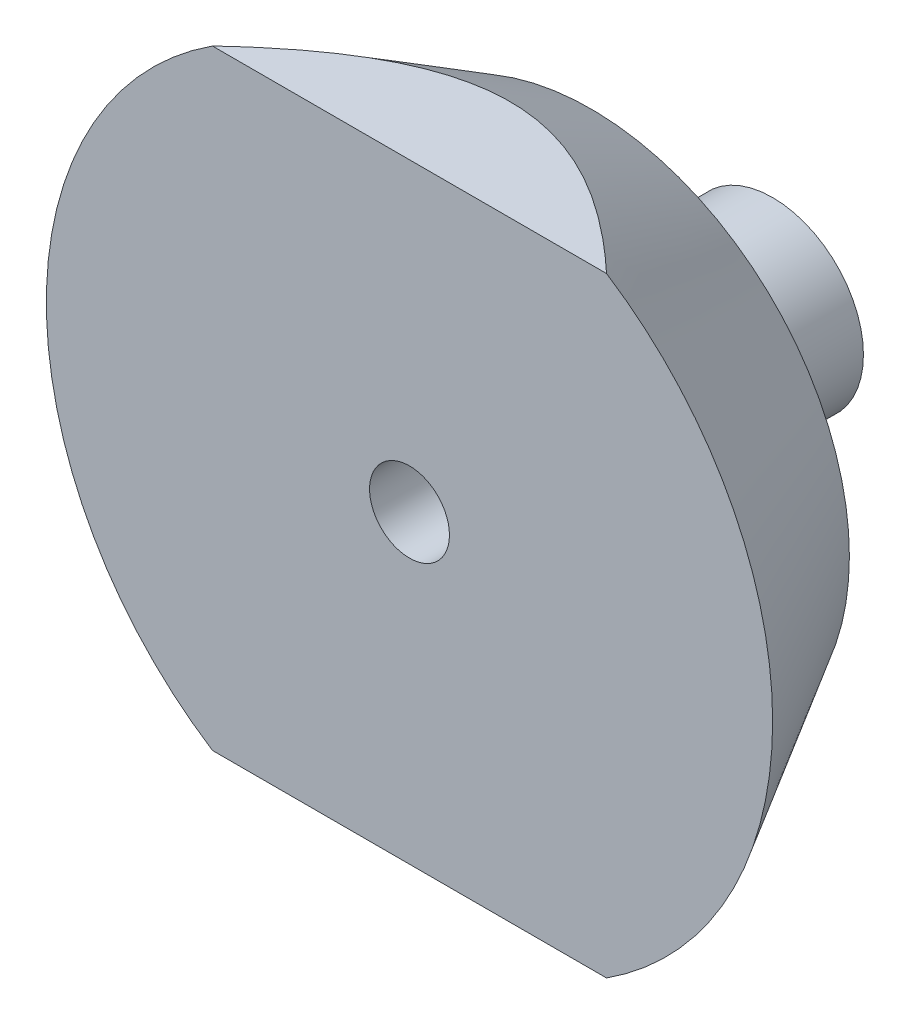
ISO-10303-21;
HEADER;
FILE_DESCRIPTION(('STEP AP214'),'2;1');
FILE_NAME('part.step','',(''),(''),'','','');
FILE_SCHEMA(('AUTOMOTIVE_DESIGN { 1 0 10303 214 1 1 1 1 }'));
ENDSEC;
DATA;
#1=APPLICATION_CONTEXT('core data for automotive mechanical design processes');
#2=APPLICATION_PROTOCOL_DEFINITION('international standard','automotive_design',2000,#1);
#3=PRODUCT_CONTEXT('',#1,'mechanical');
#4=PRODUCT('Part','Part','',(#3));
#5=PRODUCT_RELATED_PRODUCT_CATEGORY('part','',(#4));
#6=PRODUCT_DEFINITION_FORMATION('','',#4);
#7=PRODUCT_DEFINITION_CONTEXT('part definition',#1,'design');
#8=PRODUCT_DEFINITION('design','',#6,#7);
#9=PRODUCT_DEFINITION_SHAPE('','',#8);
#10=(LENGTH_UNIT() NAMED_UNIT(*) SI_UNIT(.MILLI.,.METRE.));
#11=(NAMED_UNIT(*) PLANE_ANGLE_UNIT() SI_UNIT($,.RADIAN.));
#12=(NAMED_UNIT(*) SI_UNIT($,.STERADIAN.) SOLID_ANGLE_UNIT());
#13=UNCERTAINTY_MEASURE_WITH_UNIT(LENGTH_MEASURE(1.E-05),#10,'distance_accuracy_value','');
#14=(GEOMETRIC_REPRESENTATION_CONTEXT(3) GLOBAL_UNCERTAINTY_ASSIGNED_CONTEXT((#13)) GLOBAL_UNIT_ASSIGNED_CONTEXT((#10,
#11,#12)) REPRESENTATION_CONTEXT('',''));
#15=CARTESIAN_POINT('',(0.,0.,0.));
#16=DIRECTION('',(0.,0.,1.));
#17=DIRECTION('',(1.,0.,0.));
#18=AXIS2_PLACEMENT_3D('',#15,#16,#17);
#19=CARTESIAN_POINT('',(0.,0.,-25.));
#20=DIRECTION('',(0.,0.,1.));
#21=DIRECTION('',(1.,0.,0.));
#22=AXIS2_PLACEMENT_3D('',#19,#20,#21);
#23=PLANE('',#22);
#24=CARTESIAN_POINT('',(0.,0.,-25.));
#25=DIRECTION('',(0.,0.,1.));
#26=DIRECTION('',(1.,0.,0.));
#27=AXIS2_PLACEMENT_3D('',#24,#25,#26);
#28=CIRCLE('',#27,35.5662432702593);
#29=CARTESIAN_POINT('',(35.5662432702593,0.,-25.));
#30=VERTEX_POINT('',#29);
#31=EDGE_CURVE('E74',#30,#30,#28,.T.);
#32=ORIENTED_EDGE('',*,*,#31,.F.);
#33=EDGE_LOOP('',(#32));
#34=FACE_BOUND('',#33,.T.);
#35=CARTESIAN_POINT('',(0.,0.,-25.));
#36=DIRECTION('',(0.,0.,1.));
#37=DIRECTION('',(1.,0.,0.));
#38=AXIS2_PLACEMENT_3D('',#35,#36,#37);
#39=CIRCLE('',#38,12.5);
#40=CARTESIAN_POINT('',(12.5,0.,-25.));
#41=VERTEX_POINT('',#40);
#42=EDGE_CURVE('E65',#41,#41,#39,.F.);
#43=ORIENTED_EDGE('',*,*,#42,.F.);
#44=EDGE_LOOP('',(#43));
#45=FACE_BOUND('',#44,.T.);
#46=ADVANCED_FACE('F34',(#34,#45),#23,.F.);
#47=CARTESIAN_POINT('',(0.,0.,0.));
#48=DIRECTION('',(0.,0.,1.));
#49=DIRECTION('',(1.,0.,0.));
#50=AXIS2_PLACEMENT_3D('',#47,#48,#49);
#51=CONICAL_SURFACE('',#50,50.,0.523598775598299);
#52=CARTESIAN_POINT('',(-62.6660818149811,42.,44.0615841168655));
#53=CARTESIAN_POINT('',(-61.9947410984222,42.,43.0956864215137));
#54=CARTESIAN_POINT('',(-61.3211627775136,42.,42.1313402496294));
#55=CARTESIAN_POINT('',(-59.9690885189031,42.,40.2060904834421));
#56=CARTESIAN_POINT('',(-59.2905925416595,42.,39.2451869169133));
#57=CARTESIAN_POINT('',(-57.9281233807932,42.,37.3269972796684));
#58=CARTESIAN_POINT('',(-57.244149192084,42.,36.3697119225105));
#59=CARTESIAN_POINT('',(-55.8703430759937,42.,34.4593546918073));
#60=CARTESIAN_POINT('',(-55.1805111590199,42.,33.5062828107808));
#61=CARTESIAN_POINT('',(-53.7887816516999,42.,31.5970926210159));
#62=CARTESIAN_POINT('',(-53.0868315615743,42.,30.6410125635106));
#63=CARTESIAN_POINT('',(-51.6757317812286,42.,28.7341810677412));
#64=CARTESIAN_POINT('',(-50.9665821085206,42.,27.7834296165247));
#65=CARTESIAN_POINT('',(-49.540384342603,42.,25.8879999039432));
#66=CARTESIAN_POINT('',(-48.8233369687861,42.,24.9433211016402));
#67=CARTESIAN_POINT('',(-47.3804118592806,42.,23.0607386979087));
#68=CARTESIAN_POINT('',(-46.6545341899994,42.,22.1228350456127));
#69=CARTESIAN_POINT('',(-45.1242995807392,42.,20.1669947824872));
#70=CARTESIAN_POINT('',(-44.3189747120633,42.,19.1498145297742));
#71=CARTESIAN_POINT('',(-42.695003014512,42.,17.1261228495684));
#72=CARTESIAN_POINT('',(-41.8763561112709,42.,16.1196114816827));
#73=CARTESIAN_POINT('',(-40.2236364563716,42.,14.1187307038334));
#74=CARTESIAN_POINT('',(-39.389558473168,42.,13.1243656087501));
#75=CARTESIAN_POINT('',(-37.7040933652294,42.,11.1504094711475));
#76=CARTESIAN_POINT('',(-36.8527064588542,42.,10.1708182425205));
#77=CARTESIAN_POINT('',(-35.13314997558,42.,8.2327922579927));
#78=CARTESIAN_POINT('',(-34.2650525966472,42.,7.27429357646646));
#79=CARTESIAN_POINT('',(-32.5059585816512,42.,5.3783771896856));
#80=CARTESIAN_POINT('',(-31.6149606162669,42.,4.44096071414883));
#81=CARTESIAN_POINT('',(-29.807013027872,42.,2.5926240222418));
#82=CARTESIAN_POINT('',(-28.890080711358,42.,1.68168692205313));
#83=CARTESIAN_POINT('',(-27.0254087752125,42.,-0.107976363779266));
#84=CARTESIAN_POINT('',(-26.0776746617395,42.,-0.986708247350626));
#85=CARTESIAN_POINT('',(-24.5954205679735,42.,-2.30416319990149));
#86=CARTESIAN_POINT('',(-24.0737823644993,42.,-2.75740394401919));
#87=CARTESIAN_POINT('',(-23.0192309413,42.,-3.65062735944111));
#88=CARTESIAN_POINT('',(-22.4863175416664,42.,-4.09060981892238));
#89=CARTESIAN_POINT('',(-21.4079713031547,42.,-4.95562780290153));
#90=CARTESIAN_POINT('',(-20.8625315015475,42.,-5.38065466496564));
#91=CARTESIAN_POINT('',(-19.7584279094841,42.,-6.2132042341337));
#92=CARTESIAN_POINT('',(-19.1997642798946,42.,-6.62072715400205));
#93=CARTESIAN_POINT('',(-18.0743232147787,42.,-7.41126322187428));
#94=CARTESIAN_POINT('',(-17.5076990084026,42.,-7.79449388207739));
#95=CARTESIAN_POINT('',(-16.3595601498972,42.,-8.53811086745244));
#96=CARTESIAN_POINT('',(-15.7780447041416,42.,-8.89849597150164));
#97=CARTESIAN_POINT('',(-14.5998337125875,42.,-9.59250497833902));
#98=CARTESIAN_POINT('',(-14.0031510066367,42.,-9.92615058486232));
#99=CARTESIAN_POINT('',(-12.7936835758078,42.,-10.5628176269368));
#100=CARTESIAN_POINT('',(-12.1809005733317,42.,-10.865842321626));
#101=CARTESIAN_POINT('',(-10.8695896535529,42.,-11.4685589403372));
#102=CARTESIAN_POINT('',(-10.1691335434055,42.,-11.764092392304));
#103=CARTESIAN_POINT('',(-8.74890634354462,42.,-12.3045518400042));
#104=CARTESIAN_POINT('',(-8.02913744933954,42.,-12.5494835609144));
#105=CARTESIAN_POINT('',(-6.57304864221835,42.,-12.98138985883));
#106=CARTESIAN_POINT('',(-5.83674629025654,42.,-13.1684230742669));
#107=CARTESIAN_POINT('',(-4.35063596778118,42.,-13.478313424225));
#108=CARTESIAN_POINT('',(-3.60082828590588,42.,-13.6011719286197));
#109=CARTESIAN_POINT('',(-2.08661958786141,42.,-13.7785301012982));
#110=CARTESIAN_POINT('',(-1.32214873216728,42.,-13.8324409879208));
#111=CARTESIAN_POINT('',(0.208445879240947,42.,-13.8675848666588));
#112=CARTESIAN_POINT('',(0.974569564418981,42.,-13.8488209012358));
#113=CARTESIAN_POINT('',(2.50187487611513,42.,-13.7394442144813));
#114=CARTESIAN_POINT('',(3.26305477006937,42.,-13.6488075445149));
#115=CARTESIAN_POINT('',(4.77415585579113,42.,-13.399541367933));
#116=CARTESIAN_POINT('',(5.52407530702997,42.,-13.2409014597738));
#117=CARTESIAN_POINT('',(7.17219148132458,42.,-12.8196696504264));
#118=CARTESIAN_POINT('',(8.06648765436703,42.,-12.5418445630745));
#119=CARTESIAN_POINT('',(9.82630494481529,42.,-11.9068713596006));
#120=CARTESIAN_POINT('',(10.6918166603138,42.,-11.5496976126681));
#121=CARTESIAN_POINT('',(12.3947671844926,42.,-10.7681038956561));
#122=CARTESIAN_POINT('',(13.2321163491136,42.,-10.3434900388574));
#123=CARTESIAN_POINT('',(14.4652747899752,42.,-9.66570296258866));
#124=CARTESIAN_POINT('',(14.872520241991,42.,-9.43296063537934));
#125=CARTESIAN_POINT('',(15.6797050812778,42.,-8.95508159989258));
#126=CARTESIAN_POINT('',(16.0796442454543,42.,-8.70994451400477));
#127=CARTESIAN_POINT('',(16.9932524277029,42.,-8.13206051707581));
#128=CARTESIAN_POINT('',(17.5044333618833,42.,-7.79538286613526));
#129=CARTESIAN_POINT('',(18.5154072491166,42.,-7.10528622472515));
#130=CARTESIAN_POINT('',(19.0151990175825,42.,-6.7518655044735));
#131=CARTESIAN_POINT('',(20.0042243687353,42.,-6.03019258176722));
#132=CARTESIAN_POINT('',(20.4934539404683,42.,-5.66193489205611));
#133=CARTESIAN_POINT('',(21.4618771555972,42.,-4.91243098542184));
#134=CARTESIAN_POINT('',(21.9410701925615,42.,-4.53118398728815));
#135=CARTESIAN_POINT('',(23.3662664334984,42.,-3.36893126182257));
#136=CARTESIAN_POINT('',(24.2982148914263,42.,-2.57064780328997));
#137=CARTESIAN_POINT('',(26.1294749841585,42.,-0.938069651921674));
#138=CARTESIAN_POINT('',(27.0287919843101,42.,-0.103780929005354));
#139=CARTESIAN_POINT('',(28.8112296234937,42.,1.60509319008829));
#140=CARTESIAN_POINT('',(29.6939775474352,42.,2.48006615046062));
#141=CARTESIAN_POINT('',(31.4347871674004,42.,4.25422517660469));
#142=CARTESIAN_POINT('',(32.2928479837559,42.,5.1534121029805));
#143=CARTESIAN_POINT('',(33.5633719711067,42.,6.51657486850111));
#144=CARTESIAN_POINT('',(33.9838805667921,42.,6.9730915996181));
#145=CARTESIAN_POINT('',(34.8199174331674,42.,7.89066572586818));
#146=CARTESIAN_POINT('',(35.2354457068212,42.,8.35172311829865));
#147=CARTESIAN_POINT('',(36.0618361148956,42.,9.27796021535728));
#148=CARTESIAN_POINT('',(36.4726984593376,42.,9.74313973275011));
#149=CARTESIAN_POINT('',(37.290077415774,42.,10.6772977520941));
#150=CARTESIAN_POINT('',(37.6965940279883,42.,11.1462762538531));
#151=CARTESIAN_POINT('',(39.0540571673332,42.,12.7260138550006));
#152=CARTESIAN_POINT('',(39.9957830185699,42.,13.8447100527444));
#153=CARTESIAN_POINT('',(41.859920790794,42.,16.0981078710453));
#154=CARTESIAN_POINT('',(42.7823319066966,42.,17.2328101554883));
#155=CARTESIAN_POINT('',(44.6105470916075,42.,19.5157846897765));
#156=CARTESIAN_POINT('',(45.5163486055523,42.,20.6640589834644));
#157=CARTESIAN_POINT('',(47.3133430070883,42.,22.9719424712024));
#158=CARTESIAN_POINT('',(48.2045360847345,42.,24.131551517474));
#159=CARTESIAN_POINT('',(49.9746534388642,42.,26.4611777381564));
#160=CARTESIAN_POINT('',(50.8535700799965,42.,27.6312007083542));
#161=CARTESIAN_POINT('',(52.6001093240762,42.,29.9796437797838));
#162=CARTESIAN_POINT('',(53.4677318949706,42.,31.1580639048324));
#163=CARTESIAN_POINT('',(55.1928982134197,42.,33.5221167703124));
#164=CARTESIAN_POINT('',(56.0504427187179,42.,34.7077489581827));
#165=CARTESIAN_POINT('',(57.7566113612835,42.,37.0854083910496));
#166=CARTESIAN_POINT('',(58.6052355081823,42.,38.2774356291393));
#167=CARTESIAN_POINT('',(60.2969062409541,42.,40.6705282740218));
#168=CARTESIAN_POINT('',(61.1399300894684,42.,41.8716097461957));
#169=CARTESIAN_POINT('',(62.8187639028568,42.,44.2788057734581));
#170=CARTESIAN_POINT('',(63.6545738455904,42.,45.4849203439771));
#171=CARTESIAN_POINT('',(66.1522863435999,42.,49.1099965644729));
#172=CARTESIAN_POINT('',(67.8044557048528,42.,51.5356682205054));
#173=CARTESIAN_POINT('',(71.0869067819389,42.,56.400553071834));
#174=CARTESIAN_POINT('',(72.7171957179092,42.,58.8397614050304));
#175=CARTESIAN_POINT('',(75.9599955123153,42.,63.7299396845167));
#176=CARTESIAN_POINT('',(77.5725064694076,42.,66.180909565429));
#177=CARTESIAN_POINT('',(80.592446879611,42.,70.8017483185813));
#178=CARTESIAN_POINT('',(82.0015452629966,42.,72.9705275495839));
#179=CARTESIAN_POINT('',(84.809646946218,42.,77.3146103072859));
#180=CARTESIAN_POINT('',(86.2086502429901,42.,79.4899138359652));
#181=CARTESIAN_POINT('',(88.9979806990021,42.,83.8463707371419));
#182=CARTESIAN_POINT('',(90.3883070054502,42.,86.0275246554197));
#183=CARTESIAN_POINT('',(93.1612193779019,42.,90.3947475031302));
#184=CARTESIAN_POINT('',(94.5438054387823,42.,92.5808164358147));
#185=CARTESIAN_POINT('',(97.2948953401354,42.,96.9457685373383));
#186=CARTESIAN_POINT('',(98.6634350035376,42.,99.1246291347908));
#187=CARTESIAN_POINT('',(101.394502171229,42.,103.486115586527));
#188=CARTESIAN_POINT('',(102.757029672721,42.,105.668741442563));
#189=CARTESIAN_POINT('',(105.476552882464,42.,110.037060537815));
#190=CARTESIAN_POINT('',(106.833549255268,42.,112.222753363422));
#191=CARTESIAN_POINT('',(109.54271655707,42.,116.597121847152));
#192=CARTESIAN_POINT('',(110.894887495592,42.,118.785797499375));
#193=CARTESIAN_POINT('',(112.244916652511,42.,120.975791686796));
#194=B_SPLINE_CURVE_WITH_KNOTS('',3,(#52,#53,#54,#55,#56,#57,#58,#59,#60,#61,#62,#63,#64,#65,
#66,#67,#68,#69,#70,#71,#72,#73,#74,#75,#76,#77,#78,#79,#80,#81,#82,#83,#84,#85,#86,#87,#88,#89,
#90,#91,#92,#93,#94,#95,#96,#97,#98,#99,#100,#101,#102,#103,#104,#105,#106,#107,#108,#109,#110,
#111,#112,#113,#114,#115,#116,#117,#118,#119,#120,#121,#122,#123,#124,#125,#126,#127,#128,#129,
#130,#131,#132,#133,#134,#135,#136,#137,#138,#139,#140,#141,#142,#143,#144,#145,#146,#147,#148,
#149,#150,#151,#152,#153,#154,#155,#156,#157,#158,#159,#160,#161,#162,#163,#164,#165,#166,#167,
#168,#169,#170,#171,#172,#173,#174,#175,#176,#177,#178,#179,#180,#181,#182,#183,#184,#185,#186,
#187,#188,#189,#190,#191,#192,#193),.UNSPECIFIED.,.F.,.F.,(4,2,2,2,2,2,2,2,2,2,2,2,2,2,2,2,2,2,
2,2,2,2,2,2,2,2,2,2,2,2,2,2,2,2,2,2,2,2,2,2,2,2,2,2,2,2,2,2,2,2,2,2,2,2,2,2,2,2,2,2,2,2,2,2,2,2,
2,2,2,2,4),(0.,3.52886951027551,7.05776742692678,10.5873283388627,14.1168829813054,
17.6751395904477,21.2333875466062,24.791314023206,28.349213759227,32.2412654055268,
36.1333387853649,40.0267567814946,43.9201256908513,47.7993517991019,51.6788035974736,
55.555724956098,59.431957043779,61.504892617826,63.5778612928928,65.6520115239428,
67.7261365360847,69.7778160582638,71.8296051529006,73.8797116336323,75.9295996808594,
78.2086158954375,80.4873741163706,82.763816849057,85.0402109868086,87.3359174757515,
89.631527858229,91.9279034804246,94.2246304738243,97.0294728722618,99.8352225977254,
102.649189793107,104.056198435846,105.46324996942,107.299142458357,109.13522503485,
110.971993010179,112.808871649158,116.488855674081,120.16823185923,123.896380638659,
127.624662097951,129.486652357838,131.348641509528,133.21054651502,135.072451426321,
139.459069071781,143.845869199531,148.233338583701,152.620750841742,157.010780162874,
161.400821940342,165.790531502651,170.180236324903,174.58243003139,178.984637244046,
187.789134262293,196.590650755519,205.39211838126,213.1511120612,220.910108095832,
228.669855056145,236.429607151909,244.148599336095,251.867595112348,259.585634386965,
267.303658419854),.UNSPECIFIED.);
#195=CARTESIAN_POINT('',(27.1293199325011,42.,0.));
#196=VERTEX_POINT('',#195);
#197=CARTESIAN_POINT('',(-27.1293199325011,42.,0.));
#198=VERTEX_POINT('',#197);
#199=EDGE_CURVE('E55',#196,#198,#194,.F.);
#200=ORIENTED_EDGE('',*,*,#199,.F.);
#201=CARTESIAN_POINT('',(0.,0.,0.));
#202=DIRECTION('',(0.,0.,1.));
#203=DIRECTION('',(1.,0.,0.));
#204=AXIS2_PLACEMENT_3D('',#201,#202,#203);
#205=CIRCLE('',#204,50.);
#206=CARTESIAN_POINT('',(27.1293199325011,-42.,0.));
#207=VERTEX_POINT('',#206);
#208=EDGE_CURVE('E70',#207,#196,#205,.T.);
#209=ORIENTED_EDGE('',*,*,#208,.F.);
#210=CARTESIAN_POINT('',(-62.6660818149811,-42.,44.0615841168655));
#211=CARTESIAN_POINT('',(-61.9947410984222,-42.,43.0956864215136));
#212=CARTESIAN_POINT('',(-61.3211627775136,-42.,42.1313402496294));
#213=CARTESIAN_POINT('',(-59.9690885189031,-42.,40.2060904834421));
#214=CARTESIAN_POINT('',(-59.2905925416595,-42.,39.2451869169133));
#215=CARTESIAN_POINT('',(-57.9281233807932,-42.,37.3269972796684));
#216=CARTESIAN_POINT('',(-57.244149192084,-42.,36.3697119225105));
#217=CARTESIAN_POINT('',(-55.8703430759937,-42.,34.4593546918073));
#218=CARTESIAN_POINT('',(-55.1805111590199,-42.,33.5062828107807));
#219=CARTESIAN_POINT('',(-53.7887816516999,-42.,31.5970926210159));
#220=CARTESIAN_POINT('',(-53.0868315615743,-42.,30.6410125635106));
#221=CARTESIAN_POINT('',(-51.6757317812286,-42.,28.7341810677412));
#222=CARTESIAN_POINT('',(-50.9665821085206,-42.,27.7834296165247));
#223=CARTESIAN_POINT('',(-49.540384342603,-42.,25.8879999039432));
#224=CARTESIAN_POINT('',(-48.8233369687861,-42.,24.9433211016402));
#225=CARTESIAN_POINT('',(-47.3804118592806,-42.,23.0607386979087));
#226=CARTESIAN_POINT('',(-46.6545341899994,-42.,22.1228350456127));
#227=CARTESIAN_POINT('',(-45.1242995807392,-42.,20.1669947824872));
#228=CARTESIAN_POINT('',(-44.3189747120633,-42.,19.1498145297742));
#229=CARTESIAN_POINT('',(-42.695003014512,-42.,17.1261228495683));
#230=CARTESIAN_POINT('',(-41.8763561112709,-42.,16.1196114816827));
#231=CARTESIAN_POINT('',(-40.2236364563716,-42.,14.1187307038334));
#232=CARTESIAN_POINT('',(-39.389558473168,-42.,13.1243656087501));
#233=CARTESIAN_POINT('',(-37.7040933652294,-42.,11.1504094711475));
#234=CARTESIAN_POINT('',(-36.8527064588542,-42.,10.1708182425205));
#235=CARTESIAN_POINT('',(-35.13314997558,-42.,8.23279225799269));
#236=CARTESIAN_POINT('',(-34.2650525966472,-42.,7.27429357646645));
#237=CARTESIAN_POINT('',(-32.5059585816512,-42.,5.37837718968559));
#238=CARTESIAN_POINT('',(-31.6149606162669,-42.,4.44096071414882));
#239=CARTESIAN_POINT('',(-29.807013027872,-42.,2.59262402224179));
#240=CARTESIAN_POINT('',(-28.890080711358,-42.,1.68168692205312));
#241=CARTESIAN_POINT('',(-27.0254087752125,-42.,-0.107976363779276));
#242=CARTESIAN_POINT('',(-26.0776746617395,-42.,-0.986708247350637));
#243=CARTESIAN_POINT('',(-24.5954205679735,-42.,-2.30416319990149));
#244=CARTESIAN_POINT('',(-24.0737823644993,-42.,-2.75740394401919));
#245=CARTESIAN_POINT('',(-23.0192309413,-42.,-3.6506273594411));
#246=CARTESIAN_POINT('',(-22.4863175416664,-42.,-4.09060981892239));
#247=CARTESIAN_POINT('',(-21.4079713031546,-42.,-4.95562780290153));
#248=CARTESIAN_POINT('',(-20.8625315015475,-42.,-5.38065466496564));
#249=CARTESIAN_POINT('',(-19.7584279094841,-42.,-6.2132042341337));
#250=CARTESIAN_POINT('',(-19.1997642798946,-42.,-6.62072715400205));
#251=CARTESIAN_POINT('',(-18.0743232147787,-42.,-7.41126322187428));
#252=CARTESIAN_POINT('',(-17.5076990084025,-42.,-7.79449388207739));
#253=CARTESIAN_POINT('',(-16.3595601498972,-42.,-8.53811086745244));
#254=CARTESIAN_POINT('',(-15.7780447041416,-42.,-8.89849597150162));
#255=CARTESIAN_POINT('',(-14.5998337125875,-42.,-9.59250497833901));
#256=CARTESIAN_POINT('',(-14.0031510066367,-42.,-9.92615058486232));
#257=CARTESIAN_POINT('',(-12.7936835758078,-42.,-10.5628176269368));
#258=CARTESIAN_POINT('',(-12.1809005733317,-42.,-10.865842321626));
#259=CARTESIAN_POINT('',(-10.8695896535529,-42.,-11.4685589403372));
#260=CARTESIAN_POINT('',(-10.1691335434055,-42.,-11.764092392304));
#261=CARTESIAN_POINT('',(-8.74890634354461,-42.,-12.3045518400042));
#262=CARTESIAN_POINT('',(-8.02913744933952,-42.,-12.5494835609144));
#263=CARTESIAN_POINT('',(-6.57304864221834,-42.,-12.98138985883));
#264=CARTESIAN_POINT('',(-5.83674629025653,-42.,-13.1684230742669));
#265=CARTESIAN_POINT('',(-4.35063596778118,-42.,-13.478313424225));
#266=CARTESIAN_POINT('',(-3.60082828590588,-42.,-13.6011719286197));
#267=CARTESIAN_POINT('',(-2.08661958786141,-42.,-13.7785301012982));
#268=CARTESIAN_POINT('',(-1.32214873216728,-42.,-13.8324409879208));
#269=CARTESIAN_POINT('',(0.208445879240947,-42.,-13.8675848666588));
#270=CARTESIAN_POINT('',(0.97456956441898,-42.,-13.8488209012358));
#271=CARTESIAN_POINT('',(2.50187487611512,-42.,-13.7394442144813));
#272=CARTESIAN_POINT('',(3.26305477006937,-42.,-13.6488075445148));
#273=CARTESIAN_POINT('',(4.77415585579113,-42.,-13.399541367933));
#274=CARTESIAN_POINT('',(5.52407530702997,-42.,-13.2409014597738));
#275=CARTESIAN_POINT('',(7.17219148132458,-42.,-12.8196696504264));
#276=CARTESIAN_POINT('',(8.06648765436702,-42.,-12.5418445630745));
#277=CARTESIAN_POINT('',(9.82630494481528,-42.,-11.9068713596006));
#278=CARTESIAN_POINT('',(10.6918166603138,-42.,-11.549697612668));
#279=CARTESIAN_POINT('',(12.3947671844925,-42.,-10.7681038956561));
#280=CARTESIAN_POINT('',(13.2321163491135,-42.,-10.3434900388574));
#281=CARTESIAN_POINT('',(14.4652747899751,-42.,-9.66570296258865));
#282=CARTESIAN_POINT('',(14.872520241991,-42.,-9.43296063537933));
#283=CARTESIAN_POINT('',(15.6797050812778,-42.,-8.95508159989258));
#284=CARTESIAN_POINT('',(16.0796442454543,-42.,-8.70994451400477));
#285=CARTESIAN_POINT('',(16.9932524277029,-42.,-8.13206051707581));
#286=CARTESIAN_POINT('',(17.5044333618833,-42.,-7.79538286613525));
#287=CARTESIAN_POINT('',(18.5154072491166,-42.,-7.10528622472515));
#288=CARTESIAN_POINT('',(19.0151990175825,-42.,-6.7518655044735));
#289=CARTESIAN_POINT('',(20.0042243687353,-42.,-6.03019258176723));
#290=CARTESIAN_POINT('',(20.4934539404682,-42.,-5.66193489205611));
#291=CARTESIAN_POINT('',(21.4618771555972,-42.,-4.91243098542184));
#292=CARTESIAN_POINT('',(21.9410701925615,-42.,-4.53118398728815));
#293=CARTESIAN_POINT('',(23.3662664334984,-42.,-3.36893126182258));
#294=CARTESIAN_POINT('',(24.2982148914263,-42.,-2.57064780328997));
#295=CARTESIAN_POINT('',(26.1294749841585,-42.,-0.938069651921674));
#296=CARTESIAN_POINT('',(27.0287919843101,-42.,-0.10378092900536));
#297=CARTESIAN_POINT('',(28.8112296234937,-42.,1.60509319008828));
#298=CARTESIAN_POINT('',(29.6939775474352,-42.,2.48006615046062));
#299=CARTESIAN_POINT('',(31.4347871674004,-42.,4.2542251766047));
#300=CARTESIAN_POINT('',(32.2928479837559,-42.,5.15341210298049));
#301=CARTESIAN_POINT('',(33.5633719711066,-42.,6.5165748685011));
#302=CARTESIAN_POINT('',(33.9838805667921,-42.,6.9730915996181));
#303=CARTESIAN_POINT('',(34.8199174331674,-42.,7.89066572586818));
#304=CARTESIAN_POINT('',(35.2354457068212,-42.,8.35172311829865));
#305=CARTESIAN_POINT('',(36.0618361148956,-42.,9.27796021535728));
#306=CARTESIAN_POINT('',(36.4726984593375,-42.,9.74313973275009));
#307=CARTESIAN_POINT('',(37.290077415774,-42.,10.6772977520941));
#308=CARTESIAN_POINT('',(37.6965940279883,-42.,11.1462762538531));
#309=CARTESIAN_POINT('',(39.0540571673332,-42.,12.7260138550006));
#310=CARTESIAN_POINT('',(39.9957830185699,-42.,13.8447100527444));
#311=CARTESIAN_POINT('',(41.859920790794,-42.,16.0981078710453));
#312=CARTESIAN_POINT('',(42.7823319066965,-42.,17.2328101554883));
#313=CARTESIAN_POINT('',(44.6105470916075,-42.,19.5157846897764));
#314=CARTESIAN_POINT('',(45.5163486055523,-42.,20.6640589834644));
#315=CARTESIAN_POINT('',(47.3133430070883,-42.,22.9719424712024));
#316=CARTESIAN_POINT('',(48.2045360847345,-42.,24.131551517474));
#317=CARTESIAN_POINT('',(49.9746534388642,-42.,26.4611777381564));
#318=CARTESIAN_POINT('',(50.8535700799965,-42.,27.6312007083542));
#319=CARTESIAN_POINT('',(52.6001093240762,-42.,29.9796437797838));
#320=CARTESIAN_POINT('',(53.4677318949706,-42.,31.1580639048324));
#321=CARTESIAN_POINT('',(55.1928982134197,-42.,33.5221167703123));
#322=CARTESIAN_POINT('',(56.0504427187179,-42.,34.7077489581827));
#323=CARTESIAN_POINT('',(57.7566113612835,-42.,37.0854083910496));
#324=CARTESIAN_POINT('',(58.6052355081823,-42.,38.2774356291393));
#325=CARTESIAN_POINT('',(60.2969062409541,-42.,40.6705282740218));
#326=CARTESIAN_POINT('',(61.1399300894684,-42.,41.8716097461957));
#327=CARTESIAN_POINT('',(62.8187639028568,-42.,44.2788057734581));
#328=CARTESIAN_POINT('',(63.6545738455904,-42.,45.4849203439771));
#329=CARTESIAN_POINT('',(66.1522863435999,-42.,49.1099965644729));
#330=CARTESIAN_POINT('',(67.8044557048528,-42.,51.5356682205054));
#331=CARTESIAN_POINT('',(71.0869067819389,-42.,56.4005530718339));
#332=CARTESIAN_POINT('',(72.7171957179092,-42.,58.8397614050303));
#333=CARTESIAN_POINT('',(75.9599955123153,-42.,63.7299396845167));
#334=CARTESIAN_POINT('',(77.5725064694076,-42.,66.180909565429));
#335=CARTESIAN_POINT('',(80.592446879611,-42.,70.8017483185812));
#336=CARTESIAN_POINT('',(82.0015452629965,-42.,72.9705275495839));
#337=CARTESIAN_POINT('',(84.8096469462179,-42.,77.3146103072859));
#338=CARTESIAN_POINT('',(86.2086502429901,-42.,79.4899138359651));
#339=CARTESIAN_POINT('',(88.997980699002,-42.,83.8463707371419));
#340=CARTESIAN_POINT('',(90.3883070054502,-42.,86.0275246554196));
#341=CARTESIAN_POINT('',(93.1612193779019,-42.,90.3947475031301));
#342=CARTESIAN_POINT('',(94.5438054387823,-42.,92.5808164358147));
#343=CARTESIAN_POINT('',(97.2948953401354,-42.,96.9457685373382));
#344=CARTESIAN_POINT('',(98.6634350035376,-42.,99.1246291347908));
#345=CARTESIAN_POINT('',(101.394502171229,-42.,103.486115586527));
#346=CARTESIAN_POINT('',(102.75702967272,-42.,105.668741442563));
#347=CARTESIAN_POINT('',(105.476552882464,-42.,110.037060537815));
#348=CARTESIAN_POINT('',(106.833549255268,-42.,112.222753363422));
#349=CARTESIAN_POINT('',(109.54271655707,-42.,116.597121847152));
#350=CARTESIAN_POINT('',(110.894887495591,-42.,118.785797499375));
#351=CARTESIAN_POINT('',(112.24491665251,-42.,120.975791686796));
#352=B_SPLINE_CURVE_WITH_KNOTS('',3,(#210,#211,#212,#213,#214,#215,#216,#217,#218,#219,#220,
#221,#222,#223,#224,#225,#226,#227,#228,#229,#230,#231,#232,#233,#234,#235,#236,#237,#238,#239,
#240,#241,#242,#243,#244,#245,#246,#247,#248,#249,#250,#251,#252,#253,#254,#255,#256,#257,#258,
#259,#260,#261,#262,#263,#264,#265,#266,#267,#268,#269,#270,#271,#272,#273,#274,#275,#276,#277,
#278,#279,#280,#281,#282,#283,#284,#285,#286,#287,#288,#289,#290,#291,#292,#293,#294,#295,#296,
#297,#298,#299,#300,#301,#302,#303,#304,#305,#306,#307,#308,#309,#310,#311,#312,#313,#314,#315,
#316,#317,#318,#319,#320,#321,#322,#323,#324,#325,#326,#327,#328,#329,#330,#331,#332,#333,#334,
#335,#336,#337,#338,#339,#340,#341,#342,#343,#344,#345,#346,#347,#348,#349,#350,#351),
.UNSPECIFIED.,.F.,.F.,(4,2,2,2,2,2,2,2,2,2,2,2,2,2,2,2,2,2,2,2,2,2,2,2,2,2,2,2,2,2,2,2,2,2,2,2,
2,2,2,2,2,2,2,2,2,2,2,2,2,2,2,2,2,2,2,2,2,2,2,2,2,2,2,2,2,2,2,2,2,2,4),(0.,3.5288695102755,
7.05776742692676,10.5873283388627,14.1168829813054,17.6751395904477,21.2333875466061,
24.791314023206,28.349213759227,32.2412654055268,36.1333387853649,40.0267567814946,
43.9201256908513,47.7993517991019,51.6788035974736,55.555724956098,59.431957043779,
61.504892617826,63.5778612928928,65.6520115239427,67.7261365360846,69.7778160582637,
71.8296051529006,73.8797116336322,75.9295996808593,78.2086158954374,80.4873741163706,
82.763816849057,85.0402109868086,87.3359174757514,89.631527858229,91.9279034804245,
94.2246304738243,97.0294728722617,99.8352225977254,102.649189793107,104.056198435846,
105.46324996942,107.299142458357,109.13522503485,110.971993010179,112.808871649158,
116.488855674081,120.16823185923,123.896380638659,127.624662097951,129.486652357838,
131.348641509528,133.21054651502,135.07245142632,139.459069071781,143.845869199531,
148.233338583701,152.620750841741,157.010780162874,161.400821940342,165.790531502651,
170.180236324903,174.58243003139,178.984637244046,187.789134262293,196.590650755519,
205.39211838126,213.1511120612,220.910108095832,228.669855056145,236.429607151909,
244.148599336095,251.867595112348,259.585634386965,267.303658419854),.UNSPECIFIED.);
#353=CARTESIAN_POINT('',(-27.1293199325011,-42.,0.));
#354=VERTEX_POINT('',#353);
#355=EDGE_CURVE('E49',#354,#207,#352,.T.);
#356=ORIENTED_EDGE('',*,*,#355,.F.);
#357=EDGE_CURVE('E69',#198,#354,#205,.T.);
#358=ORIENTED_EDGE('',*,*,#357,.F.);
#359=EDGE_LOOP('',(#200,#209,#356,#358));
#360=FACE_BOUND('',#359,.T.);
#361=ORIENTED_EDGE('',*,*,#31,.T.);
#362=EDGE_LOOP('',(#361));
#363=FACE_BOUND('',#362,.T.);
#364=ADVANCED_FACE('F36',(#360,#363),#51,.T.);
#365=CARTESIAN_POINT('',(0.,0.,0.));
#366=DIRECTION('',(0.,0.,1.));
#367=DIRECTION('',(1.,0.,0.));
#368=AXIS2_PLACEMENT_3D('',#365,#366,#367);
#369=PLANE('',#368);
#370=DIRECTION('',(1.,0.,0.));
#371=VECTOR('',#370,1.);
#372=CARTESIAN_POINT('',(0.,42.,0.));
#373=LINE('',#372,#371);
#374=EDGE_CURVE('E11',#198,#196,#373,.T.);
#375=ORIENTED_EDGE('',*,*,#374,.F.);
#376=ORIENTED_EDGE('',*,*,#357,.T.);
#377=DIRECTION('',(-1.,0.,0.));
#378=VECTOR('',#377,1.);
#379=CARTESIAN_POINT('',(0.,-42.,0.));
#380=LINE('',#379,#378);
#381=EDGE_CURVE('E43',#207,#354,#380,.T.);
#382=ORIENTED_EDGE('',*,*,#381,.F.);
#383=ORIENTED_EDGE('',*,*,#208,.T.);
#384=EDGE_LOOP('',(#375,#376,#382,#383));
#385=FACE_BOUND('',#384,.T.);
#386=CARTESIAN_POINT('',(0.,0.,0.));
#387=DIRECTION('',(0.,0.,1.));
#388=DIRECTION('',(1.,0.,0.));
#389=AXIS2_PLACEMENT_3D('',#386,#387,#388);
#390=CIRCLE('',#389,5.49999999999999);
#391=CARTESIAN_POINT('',(5.49999999999999,0.,0.));
#392=VERTEX_POINT('',#391);
#393=EDGE_CURVE('E87',#392,#392,#390,.T.);
#394=ORIENTED_EDGE('',*,*,#393,.F.);
#395=EDGE_LOOP('',(#394));
#396=FACE_BOUND('',#395,.T.);
#397=ADVANCED_FACE('F72',(#385,#396),#369,.T.);
#398=CARTESIAN_POINT('',(0.,0.,-50.));
#399=DIRECTION('',(0.,0.,1.));
#400=DIRECTION('',(1.,0.,0.));
#401=AXIS2_PLACEMENT_3D('',#398,#399,#400);
#402=CYLINDRICAL_SURFACE('',#401,12.5);
#403=CARTESIAN_POINT('',(0.,0.,-50.));
#404=DIRECTION('',(0.,0.,-1.));
#405=DIRECTION('',(-1.,0.,0.));
#406=AXIS2_PLACEMENT_3D('',#403,#404,#405);
#407=CIRCLE('',#406,12.5);
#408=CARTESIAN_POINT('',(-12.5,0.,-50.));
#409=VERTEX_POINT('',#408);
#410=EDGE_CURVE('E78',#409,#409,#407,.T.);
#411=ORIENTED_EDGE('',*,*,#410,.F.);
#412=EDGE_LOOP('',(#411));
#413=FACE_BOUND('',#412,.T.);
#414=ORIENTED_EDGE('',*,*,#42,.T.);
#415=EDGE_LOOP('',(#414));
#416=FACE_BOUND('',#415,.T.);
#417=ADVANCED_FACE('F111',(#413,#416),#402,.T.);
#418=CARTESIAN_POINT('',(0.,0.,-50.));
#419=DIRECTION('',(0.,0.,-1.));
#420=DIRECTION('',(-1.,0.,0.));
#421=AXIS2_PLACEMENT_3D('',#418,#419,#420);
#422=PLANE('',#421);
#423=CARTESIAN_POINT('',(0.,0.,-50.));
#424=DIRECTION('',(0.,0.,-1.));
#425=DIRECTION('',(-1.,0.,0.));
#426=AXIS2_PLACEMENT_3D('',#423,#424,#425);
#427=CIRCLE('',#426,8.);
#428=CARTESIAN_POINT('',(-8.,0.,-50.));
#429=VERTEX_POINT('',#428);
#430=EDGE_CURVE('E86',#429,#429,#427,.T.);
#431=ORIENTED_EDGE('',*,*,#430,.F.);
#432=EDGE_LOOP('',(#431));
#433=FACE_BOUND('',#432,.T.);
#434=ORIENTED_EDGE('',*,*,#410,.T.);
#435=EDGE_LOOP('',(#434));
#436=FACE_BOUND('',#435,.T.);
#437=ADVANCED_FACE('F109',(#433,#436),#422,.T.);
#438=CARTESIAN_POINT('',(0.,0.,-34.));
#439=DIRECTION('',(0.,0.,-1.));
#440=DIRECTION('',(-1.,0.,0.));
#441=AXIS2_PLACEMENT_3D('',#438,#439,#440);
#442=CYLINDRICAL_SURFACE('',#441,8.);
#443=CARTESIAN_POINT('',(0.,0.,-34.));
#444=DIRECTION('',(0.,0.,-1.));
#445=DIRECTION('',(-1.,0.,0.));
#446=AXIS2_PLACEMENT_3D('',#443,#444,#445);
#447=CIRCLE('',#446,8.);
#448=CARTESIAN_POINT('',(-8.,0.,-34.));
#449=VERTEX_POINT('',#448);
#450=EDGE_CURVE('E91',#449,#449,#447,.T.);
#451=ORIENTED_EDGE('',*,*,#450,.F.);
#452=EDGE_LOOP('',(#451));
#453=FACE_BOUND('',#452,.T.);
#454=ORIENTED_EDGE('',*,*,#430,.T.);
#455=EDGE_LOOP('',(#454));
#456=FACE_BOUND('',#455,.T.);
#457=ADVANCED_FACE('F140',(#453,#456),#442,.F.);
#458=CARTESIAN_POINT('',(0.,0.,-34.));
#459=DIRECTION('',(0.,0.,-1.));
#460=DIRECTION('',(-1.,0.,0.));
#461=AXIS2_PLACEMENT_3D('',#458,#459,#460);
#462=PLANE('',#461);
#463=CARTESIAN_POINT('',(0.,0.,-34.));
#464=DIRECTION('',(0.,0.,-1.));
#465=DIRECTION('',(-1.,0.,0.));
#466=AXIS2_PLACEMENT_3D('',#463,#464,#465);
#467=CIRCLE('',#466,5.49999999999999);
#468=CARTESIAN_POINT('',(-5.49999999999999,0.,-34.));
#469=VERTEX_POINT('',#468);
#470=EDGE_CURVE('E84',#469,#469,#467,.T.);
#471=ORIENTED_EDGE('',*,*,#470,.F.);
#472=EDGE_LOOP('',(#471));
#473=FACE_BOUND('',#472,.T.);
#474=ORIENTED_EDGE('',*,*,#450,.T.);
#475=EDGE_LOOP('',(#474));
#476=FACE_BOUND('',#475,.T.);
#477=ADVANCED_FACE('F147',(#473,#476),#462,.T.);
#478=CARTESIAN_POINT('',(0.,0.,0.));
#479=DIRECTION('',(0.,0.,1.));
#480=DIRECTION('',(1.,0.,0.));
#481=AXIS2_PLACEMENT_3D('',#478,#479,#480);
#482=CYLINDRICAL_SURFACE('',#481,5.49999999999999);
#483=ORIENTED_EDGE('',*,*,#470,.T.);
#484=EDGE_LOOP('',(#483));
#485=FACE_BOUND('',#484,.T.);
#486=ORIENTED_EDGE('',*,*,#393,.T.);
#487=EDGE_LOOP('',(#486));
#488=FACE_BOUND('',#487,.T.);
#489=ADVANCED_FACE('F155',(#485,#488),#482,.F.);
#490=CARTESIAN_POINT('',(-60.,-42.,0.));
#491=DIRECTION('',(0.,1.,0.));
#492=DIRECTION('',(-1.,0.,0.));
#493=AXIS2_PLACEMENT_3D('',#490,#491,#492);
#494=PLANE('',#493);
#495=ORIENTED_EDGE('',*,*,#355,.T.);
#496=ORIENTED_EDGE('',*,*,#381,.T.);
#497=EDGE_LOOP('',(#495,#496));
#498=FACE_BOUND('',#497,.T.);
#499=ADVANCED_FACE('F60',(#498),#494,.F.);
#500=CARTESIAN_POINT('',(55.,42.,0.));
#501=DIRECTION('',(0.,-1.,0.));
#502=DIRECTION('',(0.,0.,-1.));
#503=AXIS2_PLACEMENT_3D('',#500,#501,#502);
#504=PLANE('',#503);
#505=ORIENTED_EDGE('',*,*,#199,.T.);
#506=ORIENTED_EDGE('',*,*,#374,.T.);
#507=EDGE_LOOP('',(#505,#506));
#508=FACE_BOUND('',#507,.T.);
#509=ADVANCED_FACE('F169',(#508),#504,.F.);
#510=CLOSED_SHELL('',(#46,#364,#397,#417,#437,#457,#477,#489,#499,#509));
#511=MANIFOLD_SOLID_BREP('B2',#510);
#512=ADVANCED_BREP_SHAPE_REPRESENTATION('',(#18,#511),#14);
#513=SHAPE_DEFINITION_REPRESENTATION(#9,#512);
ENDSEC;
END-ISO-10303-21;
